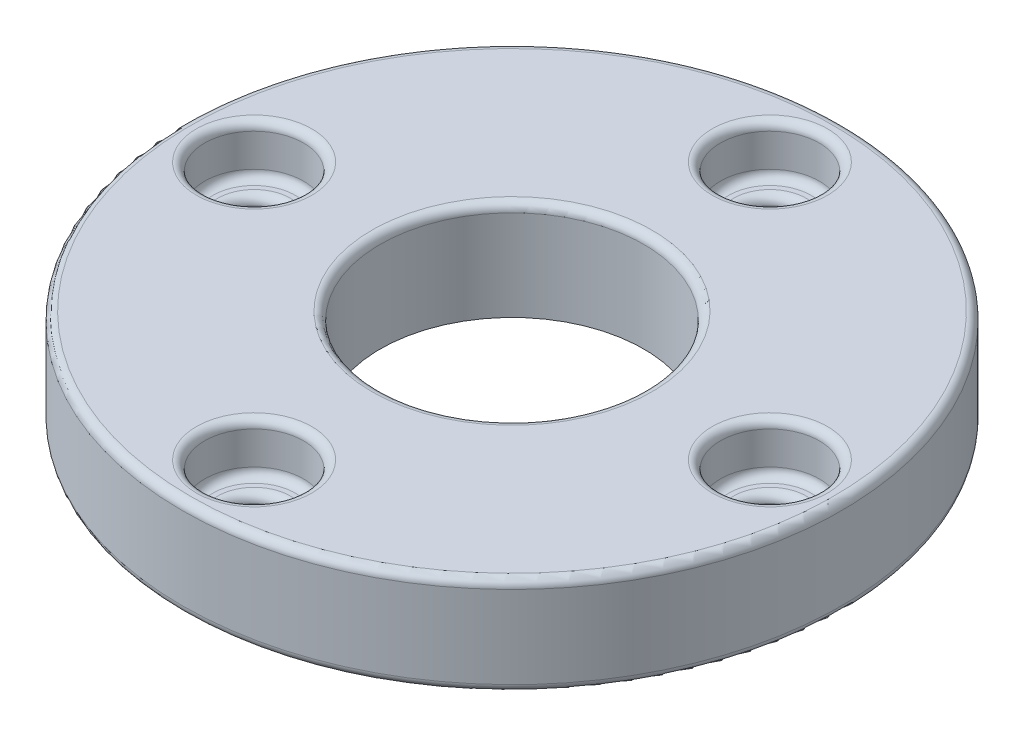
ISO-10303-21;
HEADER;
FILE_DESCRIPTION(('STEP AP214'),'2;1');
FILE_NAME('part.step','',(''),(''),'','','');
FILE_SCHEMA(('AUTOMOTIVE_DESIGN { 1 0 10303 214 1 1 1 1 }'));
ENDSEC;
DATA;
#1=APPLICATION_CONTEXT('core data for automotive mechanical design processes');
#2=APPLICATION_PROTOCOL_DEFINITION('international standard','automotive_design',2000,#1);
#3=PRODUCT_CONTEXT('',#1,'mechanical');
#4=PRODUCT('Part','Part','',(#3));
#5=PRODUCT_RELATED_PRODUCT_CATEGORY('part','',(#4));
#6=PRODUCT_DEFINITION_FORMATION('','',#4);
#7=PRODUCT_DEFINITION_CONTEXT('part definition',#1,'design');
#8=PRODUCT_DEFINITION('design','',#6,#7);
#9=PRODUCT_DEFINITION_SHAPE('','',#8);
#10=(LENGTH_UNIT() NAMED_UNIT(*) SI_UNIT(.MILLI.,.METRE.));
#11=(NAMED_UNIT(*) PLANE_ANGLE_UNIT() SI_UNIT($,.RADIAN.));
#12=(NAMED_UNIT(*) SI_UNIT($,.STERADIAN.) SOLID_ANGLE_UNIT());
#13=UNCERTAINTY_MEASURE_WITH_UNIT(LENGTH_MEASURE(1.E-05),#10,'distance_accuracy_value','');
#14=(GEOMETRIC_REPRESENTATION_CONTEXT(3) GLOBAL_UNCERTAINTY_ASSIGNED_CONTEXT((#13)) GLOBAL_UNIT_ASSIGNED_CONTEXT((#10,
#11,#12)) REPRESENTATION_CONTEXT('',''));
#15=CARTESIAN_POINT('',(0.,0.,0.));
#16=DIRECTION('',(0.,0.,1.));
#17=DIRECTION('',(1.,0.,0.));
#18=AXIS2_PLACEMENT_3D('',#15,#16,#17);
#19=CARTESIAN_POINT('',(15.65,0.,0.));
#20=DIRECTION('',(0.,1.,0.));
#21=DIRECTION('',(0.,0.,1.));
#22=AXIS2_PLACEMENT_3D('',#19,#20,#21);
#23=CYLINDRICAL_SURFACE('',#22,1.7);
#24=CARTESIAN_POINT('',(15.65,2.5,0.));
#25=DIRECTION('',(0.,1.,0.));
#26=DIRECTION('',(0.,0.,1.));
#27=AXIS2_PLACEMENT_3D('',#24,#25,#26);
#28=CIRCLE('',#27,1.7);
#29=CARTESIAN_POINT('',(15.65,2.5,1.7));
#30=VERTEX_POINT('',#29);
#31=EDGE_CURVE('E78',#30,#30,#28,.T.);
#32=ORIENTED_EDGE('',*,*,#31,.T.);
#33=EDGE_LOOP('',(#32));
#34=FACE_BOUND('',#33,.T.);
#35=CARTESIAN_POINT('',(15.65,0.,0.));
#36=DIRECTION('',(0.,1.,0.));
#37=DIRECTION('',(0.,0.,1.));
#38=AXIS2_PLACEMENT_3D('',#35,#36,#37);
#39=CIRCLE('',#38,1.7);
#40=CARTESIAN_POINT('',(15.65,0.,1.7));
#41=VERTEX_POINT('',#40);
#42=EDGE_CURVE('E139',#41,#41,#39,.T.);
#43=ORIENTED_EDGE('',*,*,#42,.F.);
#44=EDGE_LOOP('',(#43));
#45=FACE_BOUND('',#44,.T.);
#46=ADVANCED_FACE('F37',(#34,#45),#23,.F.);
#47=CARTESIAN_POINT('',(0.,0.,15.65));
#48=DIRECTION('',(0.,1.,0.));
#49=DIRECTION('',(0.,0.,1.));
#50=AXIS2_PLACEMENT_3D('',#47,#48,#49);
#51=CYLINDRICAL_SURFACE('',#50,1.7);
#52=CARTESIAN_POINT('',(0.,2.5,15.65));
#53=DIRECTION('',(0.,1.,0.));
#54=DIRECTION('',(0.,0.,1.));
#55=AXIS2_PLACEMENT_3D('',#52,#53,#54);
#56=CIRCLE('',#55,1.7);
#57=CARTESIAN_POINT('',(0.,2.5,17.35));
#58=VERTEX_POINT('',#57);
#59=EDGE_CURVE('E90',#58,#58,#56,.T.);
#60=ORIENTED_EDGE('',*,*,#59,.T.);
#61=EDGE_LOOP('',(#60));
#62=FACE_BOUND('',#61,.T.);
#63=CARTESIAN_POINT('',(0.,0.,15.65));
#64=DIRECTION('',(0.,1.,0.));
#65=DIRECTION('',(0.,0.,1.));
#66=AXIS2_PLACEMENT_3D('',#63,#64,#65);
#67=CIRCLE('',#66,1.7);
#68=CARTESIAN_POINT('',(0.,0.,17.35));
#69=VERTEX_POINT('',#68);
#70=EDGE_CURVE('E142',#69,#69,#67,.T.);
#71=ORIENTED_EDGE('',*,*,#70,.F.);
#72=EDGE_LOOP('',(#71));
#73=FACE_BOUND('',#72,.T.);
#74=ADVANCED_FACE('F167',(#62,#73),#51,.F.);
#75=CARTESIAN_POINT('',(-15.65,0.,0.));
#76=DIRECTION('',(0.,1.,0.));
#77=DIRECTION('',(0.,0.,1.));
#78=AXIS2_PLACEMENT_3D('',#75,#76,#77);
#79=CYLINDRICAL_SURFACE('',#78,1.7);
#80=CARTESIAN_POINT('',(-15.65,2.5,0.));
#81=DIRECTION('',(0.,1.,0.));
#82=DIRECTION('',(0.,0.,1.));
#83=AXIS2_PLACEMENT_3D('',#80,#81,#82);
#84=CIRCLE('',#83,1.7);
#85=CARTESIAN_POINT('',(-15.65,2.5,1.7));
#86=VERTEX_POINT('',#85);
#87=EDGE_CURVE('E66',#86,#86,#84,.T.);
#88=ORIENTED_EDGE('',*,*,#87,.T.);
#89=EDGE_LOOP('',(#88));
#90=FACE_BOUND('',#89,.T.);
#91=CARTESIAN_POINT('',(-15.65,0.,0.));
#92=DIRECTION('',(0.,1.,0.));
#93=DIRECTION('',(0.,0.,1.));
#94=AXIS2_PLACEMENT_3D('',#91,#92,#93);
#95=CIRCLE('',#94,1.7);
#96=CARTESIAN_POINT('',(-15.65,0.,1.7));
#97=VERTEX_POINT('',#96);
#98=EDGE_CURVE('E145',#97,#97,#95,.T.);
#99=ORIENTED_EDGE('',*,*,#98,.F.);
#100=EDGE_LOOP('',(#99));
#101=FACE_BOUND('',#100,.T.);
#102=ADVANCED_FACE('F157',(#90,#101),#79,.F.);
#103=CARTESIAN_POINT('',(0.,0.,-15.65));
#104=DIRECTION('',(0.,1.,0.));
#105=DIRECTION('',(0.,0.,1.));
#106=AXIS2_PLACEMENT_3D('',#103,#104,#105);
#107=CYLINDRICAL_SURFACE('',#106,1.7);
#108=CARTESIAN_POINT('',(0.,2.5,-15.65));
#109=DIRECTION('',(0.,1.,0.));
#110=DIRECTION('',(0.,0.,1.));
#111=AXIS2_PLACEMENT_3D('',#108,#109,#110);
#112=CIRCLE('',#111,1.7);
#113=CARTESIAN_POINT('',(0.,2.5,-13.95));
#114=VERTEX_POINT('',#113);
#115=EDGE_CURVE('E52',#114,#114,#112,.T.);
#116=ORIENTED_EDGE('',*,*,#115,.T.);
#117=EDGE_LOOP('',(#116));
#118=FACE_BOUND('',#117,.T.);
#119=CARTESIAN_POINT('',(0.,0.,-15.65));
#120=DIRECTION('',(0.,1.,0.));
#121=DIRECTION('',(0.,0.,1.));
#122=AXIS2_PLACEMENT_3D('',#119,#120,#121);
#123=CIRCLE('',#122,1.7);
#124=CARTESIAN_POINT('',(0.,0.,-13.95));
#125=VERTEX_POINT('',#124);
#126=EDGE_CURVE('E138',#125,#125,#123,.T.);
#127=ORIENTED_EDGE('',*,*,#126,.F.);
#128=EDGE_LOOP('',(#127));
#129=FACE_BOUND('',#128,.T.);
#130=ADVANCED_FACE('F154',(#118,#129),#107,.F.);
#131=CARTESIAN_POINT('',(0.,6.,0.));
#132=DIRECTION('',(0.,-1.,0.));
#133=DIRECTION('',(0.,0.,-1.));
#134=AXIS2_PLACEMENT_3D('',#131,#132,#133);
#135=CYLINDRICAL_SURFACE('',#134,20.);
#136=CARTESIAN_POINT('',(0.,0.5,0.));
#137=DIRECTION('',(0.,1.,0.));
#138=DIRECTION('',(0.,0.,1.));
#139=AXIS2_PLACEMENT_3D('',#136,#137,#138);
#140=CIRCLE('',#139,20.);
#141=CARTESIAN_POINT('',(0.,0.5,20.));
#142=VERTEX_POINT('',#141);
#143=EDGE_CURVE('E44',#142,#142,#140,.T.);
#144=ORIENTED_EDGE('',*,*,#143,.T.);
#145=EDGE_LOOP('',(#144));
#146=FACE_BOUND('',#145,.T.);
#147=CARTESIAN_POINT('',(0.,5.5,0.));
#148=DIRECTION('',(0.,1.,0.));
#149=DIRECTION('',(0.,0.,1.));
#150=AXIS2_PLACEMENT_3D('',#147,#148,#149);
#151=CIRCLE('',#150,20.);
#152=CARTESIAN_POINT('',(0.,5.5,20.));
#153=VERTEX_POINT('',#152);
#154=EDGE_CURVE('E114',#153,#153,#151,.F.);
#155=ORIENTED_EDGE('',*,*,#154,.T.);
#156=EDGE_LOOP('',(#155));
#157=FACE_BOUND('',#156,.T.);
#158=ADVANCED_FACE('F156',(#146,#157),#135,.T.);
#159=CARTESIAN_POINT('',(0.,6.,0.));
#160=DIRECTION('',(0.,1.,0.));
#161=DIRECTION('',(0.,0.,1.));
#162=AXIS2_PLACEMENT_3D('',#159,#160,#161);
#163=PLANE('',#162);
#164=CARTESIAN_POINT('',(0.,6.,0.));
#165=DIRECTION('',(0.,1.,0.));
#166=DIRECTION('',(0.,0.,1.));
#167=AXIS2_PLACEMENT_3D('',#164,#165,#166);
#168=CIRCLE('',#167,19.5);
#169=CARTESIAN_POINT('',(0.,6.,19.5));
#170=VERTEX_POINT('',#169);
#171=EDGE_CURVE('E117',#170,#170,#168,.T.);
#172=ORIENTED_EDGE('',*,*,#171,.T.);
#173=EDGE_LOOP('',(#172));
#174=FACE_BOUND('',#173,.T.);
#175=CARTESIAN_POINT('',(0.,6.,0.));
#176=DIRECTION('',(0.,1.,0.));
#177=DIRECTION('',(0.,0.,1.));
#178=AXIS2_PLACEMENT_3D('',#175,#176,#177);
#179=CIRCLE('',#178,8.5);
#180=CARTESIAN_POINT('',(0.,6.,8.5));
#181=VERTEX_POINT('',#180);
#182=EDGE_CURVE('E120',#181,#181,#179,.F.);
#183=ORIENTED_EDGE('',*,*,#182,.T.);
#184=EDGE_LOOP('',(#183));
#185=FACE_BOUND('',#184,.T.);
#186=CARTESIAN_POINT('',(15.65,6.,0.));
#187=DIRECTION('',(0.,1.,0.));
#188=DIRECTION('',(0.,0.,1.));
#189=AXIS2_PLACEMENT_3D('',#186,#187,#188);
#190=CIRCLE('',#189,3.5);
#191=CARTESIAN_POINT('',(15.65,6.,3.5));
#192=VERTEX_POINT('',#191);
#193=EDGE_CURVE('E123',#192,#192,#190,.F.);
#194=ORIENTED_EDGE('',*,*,#193,.T.);
#195=EDGE_LOOP('',(#194));
#196=FACE_BOUND('',#195,.T.);
#197=CARTESIAN_POINT('',(0.,6.,15.65));
#198=DIRECTION('',(0.,1.,0.));
#199=DIRECTION('',(0.,0.,1.));
#200=AXIS2_PLACEMENT_3D('',#197,#198,#199);
#201=CIRCLE('',#200,3.5);
#202=CARTESIAN_POINT('',(0.,6.,19.15));
#203=VERTEX_POINT('',#202);
#204=EDGE_CURVE('E126',#203,#203,#201,.F.);
#205=ORIENTED_EDGE('',*,*,#204,.T.);
#206=EDGE_LOOP('',(#205));
#207=FACE_BOUND('',#206,.T.);
#208=CARTESIAN_POINT('',(-15.65,6.,0.));
#209=DIRECTION('',(0.,1.,0.));
#210=DIRECTION('',(0.,0.,1.));
#211=AXIS2_PLACEMENT_3D('',#208,#209,#210);
#212=CIRCLE('',#211,3.5);
#213=CARTESIAN_POINT('',(-15.65,6.,3.5));
#214=VERTEX_POINT('',#213);
#215=EDGE_CURVE('E129',#214,#214,#212,.F.);
#216=ORIENTED_EDGE('',*,*,#215,.T.);
#217=EDGE_LOOP('',(#216));
#218=FACE_BOUND('',#217,.T.);
#219=CARTESIAN_POINT('',(0.,6.,-15.65));
#220=DIRECTION('',(0.,1.,0.));
#221=DIRECTION('',(0.,0.,1.));
#222=AXIS2_PLACEMENT_3D('',#219,#220,#221);
#223=CIRCLE('',#222,3.5);
#224=CARTESIAN_POINT('',(0.,6.,-12.15));
#225=VERTEX_POINT('',#224);
#226=EDGE_CURVE('E132',#225,#225,#223,.F.);
#227=ORIENTED_EDGE('',*,*,#226,.T.);
#228=EDGE_LOOP('',(#227));
#229=FACE_BOUND('',#228,.T.);
#230=ADVANCED_FACE('F165',(#174,#185,#196,#207,#218,#229),#163,.T.);
#231=CARTESIAN_POINT('',(0.,0.,0.));
#232=DIRECTION('',(0.,1.,0.));
#233=DIRECTION('',(0.,0.,1.));
#234=AXIS2_PLACEMENT_3D('',#231,#232,#233);
#235=PLANE('',#234);
#236=CARTESIAN_POINT('',(0.,0.,0.));
#237=DIRECTION('',(0.,1.,0.));
#238=DIRECTION('',(0.,0.,1.));
#239=AXIS2_PLACEMENT_3D('',#236,#237,#238);
#240=CIRCLE('',#239,19.5);
#241=CARTESIAN_POINT('',(0.,0.,19.5));
#242=VERTEX_POINT('',#241);
#243=EDGE_CURVE('E10',#242,#242,#240,.F.);
#244=ORIENTED_EDGE('',*,*,#243,.T.);
#245=EDGE_LOOP('',(#244));
#246=FACE_BOUND('',#245,.T.);
#247=ORIENTED_EDGE('',*,*,#126,.T.);
#248=EDGE_LOOP('',(#247));
#249=FACE_BOUND('',#248,.T.);
#250=ORIENTED_EDGE('',*,*,#98,.T.);
#251=EDGE_LOOP('',(#250));
#252=FACE_BOUND('',#251,.T.);
#253=ORIENTED_EDGE('',*,*,#70,.T.);
#254=EDGE_LOOP('',(#253));
#255=FACE_BOUND('',#254,.T.);
#256=ORIENTED_EDGE('',*,*,#42,.T.);
#257=EDGE_LOOP('',(#256));
#258=FACE_BOUND('',#257,.T.);
#259=CARTESIAN_POINT('',(0.,0.,0.));
#260=DIRECTION('',(0.,1.,0.));
#261=DIRECTION('',(0.,0.,1.));
#262=AXIS2_PLACEMENT_3D('',#259,#260,#261);
#263=CIRCLE('',#262,8.);
#264=CARTESIAN_POINT('',(0.,0.,8.));
#265=VERTEX_POINT('',#264);
#266=EDGE_CURVE('E135',#265,#265,#263,.T.);
#267=ORIENTED_EDGE('',*,*,#266,.T.);
#268=EDGE_LOOP('',(#267));
#269=FACE_BOUND('',#268,.T.);
#270=ADVANCED_FACE('F151',(#246,#249,#252,#255,#258,#269),#235,.F.);
#271=CARTESIAN_POINT('',(0.,0.,0.));
#272=DIRECTION('',(0.,1.,0.));
#273=DIRECTION('',(0.,0.,1.));
#274=AXIS2_PLACEMENT_3D('',#271,#272,#273);
#275=CYLINDRICAL_SURFACE('',#274,8.);
#276=CARTESIAN_POINT('',(0.,5.5,0.));
#277=DIRECTION('',(0.,1.,0.));
#278=DIRECTION('',(0.,0.,1.));
#279=AXIS2_PLACEMENT_3D('',#276,#277,#278);
#280=CIRCLE('',#279,8.);
#281=CARTESIAN_POINT('',(0.,5.5,8.));
#282=VERTEX_POINT('',#281);
#283=EDGE_CURVE('E111',#282,#282,#280,.T.);
#284=ORIENTED_EDGE('',*,*,#283,.T.);
#285=EDGE_LOOP('',(#284));
#286=FACE_BOUND('',#285,.T.);
#287=ORIENTED_EDGE('',*,*,#266,.F.);
#288=EDGE_LOOP('',(#287));
#289=FACE_BOUND('',#288,.T.);
#290=ADVANCED_FACE('F182',(#286,#289),#275,.F.);
#291=CARTESIAN_POINT('',(0.,3.,-15.65));
#292=DIRECTION('',(0.,1.,0.));
#293=DIRECTION('',(0.,0.,1.));
#294=AXIS2_PLACEMENT_3D('',#291,#292,#293);
#295=PLANE('',#294);
#296=CARTESIAN_POINT('',(0.,3.,-15.65));
#297=DIRECTION('',(0.,1.,0.));
#298=DIRECTION('',(0.,0.,1.));
#299=AXIS2_PLACEMENT_3D('',#296,#297,#298);
#300=CIRCLE('',#299,2.2);
#301=CARTESIAN_POINT('',(0.,3.,-13.45));
#302=VERTEX_POINT('',#301);
#303=EDGE_CURVE('E57',#302,#302,#300,.F.);
#304=ORIENTED_EDGE('',*,*,#303,.T.);
#305=EDGE_LOOP('',(#304));
#306=FACE_BOUND('',#305,.T.);
#307=CARTESIAN_POINT('',(0.,3.,-15.65));
#308=DIRECTION('',(0.,1.,0.));
#309=DIRECTION('',(0.,0.,1.));
#310=AXIS2_PLACEMENT_3D('',#307,#308,#309);
#311=CIRCLE('',#310,2.5);
#312=CARTESIAN_POINT('',(0.,3.,-13.15));
#313=VERTEX_POINT('',#312);
#314=EDGE_CURVE('E60',#313,#313,#311,.T.);
#315=ORIENTED_EDGE('',*,*,#314,.T.);
#316=EDGE_LOOP('',(#315));
#317=FACE_BOUND('',#316,.T.);
#318=ADVANCED_FACE('F185',(#306,#317),#295,.T.);
#319=CARTESIAN_POINT('',(0.,3.,-15.65));
#320=DIRECTION('',(0.,1.,0.));
#321=DIRECTION('',(0.,0.,1.));
#322=AXIS2_PLACEMENT_3D('',#319,#320,#321);
#323=CYLINDRICAL_SURFACE('',#322,3.);
#324=CARTESIAN_POINT('',(0.,3.5,-15.65));
#325=DIRECTION('',(0.,1.,0.));
#326=DIRECTION('',(0.,0.,1.));
#327=AXIS2_PLACEMENT_3D('',#324,#325,#326);
#328=CIRCLE('',#327,3.);
#329=CARTESIAN_POINT('',(0.,3.5,-12.65));
#330=VERTEX_POINT('',#329);
#331=EDGE_CURVE('E48',#330,#330,#328,.F.);
#332=ORIENTED_EDGE('',*,*,#331,.T.);
#333=EDGE_LOOP('',(#332));
#334=FACE_BOUND('',#333,.T.);
#335=CARTESIAN_POINT('',(0.,5.5,-15.65));
#336=DIRECTION('',(0.,1.,0.));
#337=DIRECTION('',(0.,0.,1.));
#338=AXIS2_PLACEMENT_3D('',#335,#336,#337);
#339=CIRCLE('',#338,3.);
#340=CARTESIAN_POINT('',(0.,5.5,-12.65));
#341=VERTEX_POINT('',#340);
#342=EDGE_CURVE('E99',#341,#341,#339,.T.);
#343=ORIENTED_EDGE('',*,*,#342,.T.);
#344=EDGE_LOOP('',(#343));
#345=FACE_BOUND('',#344,.T.);
#346=ADVANCED_FACE('F254',(#334,#345),#323,.F.);
#347=CARTESIAN_POINT('',(-15.65,3.,0.));
#348=DIRECTION('',(0.,1.,0.));
#349=DIRECTION('',(0.,0.,1.));
#350=AXIS2_PLACEMENT_3D('',#347,#348,#349);
#351=PLANE('',#350);
#352=CARTESIAN_POINT('',(-15.65,3.,0.));
#353=DIRECTION('',(0.,1.,0.));
#354=DIRECTION('',(0.,0.,1.));
#355=AXIS2_PLACEMENT_3D('',#352,#353,#354);
#356=CIRCLE('',#355,2.2);
#357=CARTESIAN_POINT('',(-15.65,3.,2.2));
#358=VERTEX_POINT('',#357);
#359=EDGE_CURVE('E69',#358,#358,#356,.F.);
#360=ORIENTED_EDGE('',*,*,#359,.T.);
#361=EDGE_LOOP('',(#360));
#362=FACE_BOUND('',#361,.T.);
#363=CARTESIAN_POINT('',(-15.65,3.,0.));
#364=DIRECTION('',(0.,1.,0.));
#365=DIRECTION('',(0.,0.,1.));
#366=AXIS2_PLACEMENT_3D('',#363,#364,#365);
#367=CIRCLE('',#366,2.5);
#368=CARTESIAN_POINT('',(-15.65,3.,2.5));
#369=VERTEX_POINT('',#368);
#370=EDGE_CURVE('E72',#369,#369,#367,.T.);
#371=ORIENTED_EDGE('',*,*,#370,.T.);
#372=EDGE_LOOP('',(#371));
#373=FACE_BOUND('',#372,.T.);
#374=ADVANCED_FACE('F260',(#362,#373),#351,.T.);
#375=CARTESIAN_POINT('',(-15.65,3.,0.));
#376=DIRECTION('',(0.,1.,0.));
#377=DIRECTION('',(0.,0.,1.));
#378=AXIS2_PLACEMENT_3D('',#375,#376,#377);
#379=CYLINDRICAL_SURFACE('',#378,3.);
#380=CARTESIAN_POINT('',(-15.65,3.5,0.));
#381=DIRECTION('',(0.,1.,0.));
#382=DIRECTION('',(0.,0.,1.));
#383=AXIS2_PLACEMENT_3D('',#380,#381,#382);
#384=CIRCLE('',#383,3.);
#385=CARTESIAN_POINT('',(-15.65,3.5,3.));
#386=VERTEX_POINT('',#385);
#387=EDGE_CURVE('E63',#386,#386,#384,.F.);
#388=ORIENTED_EDGE('',*,*,#387,.T.);
#389=EDGE_LOOP('',(#388));
#390=FACE_BOUND('',#389,.T.);
#391=CARTESIAN_POINT('',(-15.65,5.5,0.));
#392=DIRECTION('',(0.,1.,0.));
#393=DIRECTION('',(0.,0.,1.));
#394=AXIS2_PLACEMENT_3D('',#391,#392,#393);
#395=CIRCLE('',#394,3.);
#396=CARTESIAN_POINT('',(-15.65,5.5,3.));
#397=VERTEX_POINT('',#396);
#398=EDGE_CURVE('E102',#397,#397,#395,.T.);
#399=ORIENTED_EDGE('',*,*,#398,.T.);
#400=EDGE_LOOP('',(#399));
#401=FACE_BOUND('',#400,.T.);
#402=ADVANCED_FACE('F264',(#390,#401),#379,.F.);
#403=CARTESIAN_POINT('',(0.,3.,15.65));
#404=DIRECTION('',(0.,1.,0.));
#405=DIRECTION('',(0.,0.,1.));
#406=AXIS2_PLACEMENT_3D('',#403,#404,#405);
#407=PLANE('',#406);
#408=CARTESIAN_POINT('',(0.,3.,15.65));
#409=DIRECTION('',(0.,1.,0.));
#410=DIRECTION('',(0.,0.,1.));
#411=AXIS2_PLACEMENT_3D('',#408,#409,#410);
#412=CIRCLE('',#411,2.2);
#413=CARTESIAN_POINT('',(0.,3.,17.85));
#414=VERTEX_POINT('',#413);
#415=EDGE_CURVE('E93',#414,#414,#412,.F.);
#416=ORIENTED_EDGE('',*,*,#415,.T.);
#417=EDGE_LOOP('',(#416));
#418=FACE_BOUND('',#417,.T.);
#419=CARTESIAN_POINT('',(0.,3.,15.65));
#420=DIRECTION('',(0.,1.,0.));
#421=DIRECTION('',(0.,0.,1.));
#422=AXIS2_PLACEMENT_3D('',#419,#420,#421);
#423=CIRCLE('',#422,2.5);
#424=CARTESIAN_POINT('',(0.,3.,18.15));
#425=VERTEX_POINT('',#424);
#426=EDGE_CURVE('E96',#425,#425,#423,.T.);
#427=ORIENTED_EDGE('',*,*,#426,.T.);
#428=EDGE_LOOP('',(#427));
#429=FACE_BOUND('',#428,.T.);
#430=ADVANCED_FACE('F267',(#418,#429),#407,.T.);
#431=CARTESIAN_POINT('',(0.,3.,15.65));
#432=DIRECTION('',(0.,1.,0.));
#433=DIRECTION('',(0.,0.,1.));
#434=AXIS2_PLACEMENT_3D('',#431,#432,#433);
#435=CYLINDRICAL_SURFACE('',#434,3.);
#436=CARTESIAN_POINT('',(0.,3.5,15.65));
#437=DIRECTION('',(0.,1.,0.));
#438=DIRECTION('',(0.,0.,1.));
#439=AXIS2_PLACEMENT_3D('',#436,#437,#438);
#440=CIRCLE('',#439,3.);
#441=CARTESIAN_POINT('',(0.,3.5,18.65));
#442=VERTEX_POINT('',#441);
#443=EDGE_CURVE('E87',#442,#442,#440,.F.);
#444=ORIENTED_EDGE('',*,*,#443,.T.);
#445=EDGE_LOOP('',(#444));
#446=FACE_BOUND('',#445,.T.);
#447=CARTESIAN_POINT('',(0.,5.5,15.65));
#448=DIRECTION('',(0.,1.,0.));
#449=DIRECTION('',(0.,0.,1.));
#450=AXIS2_PLACEMENT_3D('',#447,#448,#449);
#451=CIRCLE('',#450,3.);
#452=CARTESIAN_POINT('',(0.,5.5,18.65));
#453=VERTEX_POINT('',#452);
#454=EDGE_CURVE('E105',#453,#453,#451,.T.);
#455=ORIENTED_EDGE('',*,*,#454,.T.);
#456=EDGE_LOOP('',(#455));
#457=FACE_BOUND('',#456,.T.);
#458=ADVANCED_FACE('F272',(#446,#457),#435,.F.);
#459=CARTESIAN_POINT('',(15.65,3.,0.));
#460=DIRECTION('',(0.,1.,0.));
#461=DIRECTION('',(0.,0.,1.));
#462=AXIS2_PLACEMENT_3D('',#459,#460,#461);
#463=PLANE('',#462);
#464=CARTESIAN_POINT('',(15.65,3.,0.));
#465=DIRECTION('',(0.,1.,0.));
#466=DIRECTION('',(0.,0.,1.));
#467=AXIS2_PLACEMENT_3D('',#464,#465,#466);
#468=CIRCLE('',#467,2.2);
#469=CARTESIAN_POINT('',(15.65,3.,2.2));
#470=VERTEX_POINT('',#469);
#471=EDGE_CURVE('E81',#470,#470,#468,.F.);
#472=ORIENTED_EDGE('',*,*,#471,.T.);
#473=EDGE_LOOP('',(#472));
#474=FACE_BOUND('',#473,.T.);
#475=CARTESIAN_POINT('',(15.65,3.,0.));
#476=DIRECTION('',(0.,1.,0.));
#477=DIRECTION('',(0.,0.,1.));
#478=AXIS2_PLACEMENT_3D('',#475,#476,#477);
#479=CIRCLE('',#478,2.5);
#480=CARTESIAN_POINT('',(15.65,3.,2.5));
#481=VERTEX_POINT('',#480);
#482=EDGE_CURVE('E84',#481,#481,#479,.T.);
#483=ORIENTED_EDGE('',*,*,#482,.T.);
#484=EDGE_LOOP('',(#483));
#485=FACE_BOUND('',#484,.T.);
#486=ADVANCED_FACE('F275',(#474,#485),#463,.T.);
#487=CARTESIAN_POINT('',(15.65,3.,0.));
#488=DIRECTION('',(0.,1.,0.));
#489=DIRECTION('',(0.,0.,1.));
#490=AXIS2_PLACEMENT_3D('',#487,#488,#489);
#491=CYLINDRICAL_SURFACE('',#490,3.);
#492=CARTESIAN_POINT('',(15.65,3.5,0.));
#493=DIRECTION('',(0.,1.,0.));
#494=DIRECTION('',(0.,0.,1.));
#495=AXIS2_PLACEMENT_3D('',#492,#493,#494);
#496=CIRCLE('',#495,3.);
#497=CARTESIAN_POINT('',(15.65,3.5,3.));
#498=VERTEX_POINT('',#497);
#499=EDGE_CURVE('E75',#498,#498,#496,.F.);
#500=ORIENTED_EDGE('',*,*,#499,.T.);
#501=EDGE_LOOP('',(#500));
#502=FACE_BOUND('',#501,.T.);
#503=CARTESIAN_POINT('',(15.65,5.5,0.));
#504=DIRECTION('',(0.,1.,0.));
#505=DIRECTION('',(0.,0.,1.));
#506=AXIS2_PLACEMENT_3D('',#503,#504,#505);
#507=CIRCLE('',#506,3.);
#508=CARTESIAN_POINT('',(15.65,5.5,3.));
#509=VERTEX_POINT('',#508);
#510=EDGE_CURVE('E108',#509,#509,#507,.T.);
#511=ORIENTED_EDGE('',*,*,#510,.T.);
#512=EDGE_LOOP('',(#511));
#513=FACE_BOUND('',#512,.T.);
#514=ADVANCED_FACE('F196',(#502,#513),#491,.F.);
#515=CARTESIAN_POINT('',(0.,5.5,0.));
#516=DIRECTION('',(0.,1.,0.));
#517=DIRECTION('',(0.,0.,1.));
#518=AXIS2_PLACEMENT_3D('',#515,#516,#517);
#519=TOROIDAL_SURFACE('',#518,19.5,0.5);
#520=ORIENTED_EDGE('',*,*,#154,.F.);
#521=EDGE_LOOP('',(#520));
#522=FACE_BOUND('',#521,.T.);
#523=ORIENTED_EDGE('',*,*,#171,.F.);
#524=EDGE_LOOP('',(#523));
#525=FACE_BOUND('',#524,.T.);
#526=ADVANCED_FACE('F192',(#522,#525),#519,.T.);
#527=CARTESIAN_POINT('',(0.,5.5,0.));
#528=DIRECTION('',(0.,1.,0.));
#529=DIRECTION('',(0.,0.,1.));
#530=AXIS2_PLACEMENT_3D('',#527,#528,#529);
#531=TOROIDAL_SURFACE('',#530,8.5,0.5);
#532=ORIENTED_EDGE('',*,*,#182,.F.);
#533=EDGE_LOOP('',(#532));
#534=FACE_BOUND('',#533,.T.);
#535=ORIENTED_EDGE('',*,*,#283,.F.);
#536=EDGE_LOOP('',(#535));
#537=FACE_BOUND('',#536,.T.);
#538=ADVANCED_FACE('F195',(#534,#537),#531,.T.);
#539=CARTESIAN_POINT('',(15.65,5.5,0.));
#540=DIRECTION('',(0.,1.,0.));
#541=DIRECTION('',(0.,0.,1.));
#542=AXIS2_PLACEMENT_3D('',#539,#540,#541);
#543=TOROIDAL_SURFACE('',#542,3.5,0.5);
#544=ORIENTED_EDGE('',*,*,#193,.F.);
#545=EDGE_LOOP('',(#544));
#546=FACE_BOUND('',#545,.T.);
#547=ORIENTED_EDGE('',*,*,#510,.F.);
#548=EDGE_LOOP('',(#547));
#549=FACE_BOUND('',#548,.T.);
#550=ADVANCED_FACE('F200',(#546,#549),#543,.T.);
#551=CARTESIAN_POINT('',(0.,5.5,15.65));
#552=DIRECTION('',(0.,1.,0.));
#553=DIRECTION('',(0.,0.,1.));
#554=AXIS2_PLACEMENT_3D('',#551,#552,#553);
#555=TOROIDAL_SURFACE('',#554,3.5,0.5);
#556=ORIENTED_EDGE('',*,*,#204,.F.);
#557=EDGE_LOOP('',(#556));
#558=FACE_BOUND('',#557,.T.);
#559=ORIENTED_EDGE('',*,*,#454,.F.);
#560=EDGE_LOOP('',(#559));
#561=FACE_BOUND('',#560,.T.);
#562=ADVANCED_FACE('F204',(#558,#561),#555,.T.);
#563=CARTESIAN_POINT('',(-15.65,5.5,0.));
#564=DIRECTION('',(0.,1.,0.));
#565=DIRECTION('',(0.,0.,1.));
#566=AXIS2_PLACEMENT_3D('',#563,#564,#565);
#567=TOROIDAL_SURFACE('',#566,3.5,0.5);
#568=ORIENTED_EDGE('',*,*,#215,.F.);
#569=EDGE_LOOP('',(#568));
#570=FACE_BOUND('',#569,.T.);
#571=ORIENTED_EDGE('',*,*,#398,.F.);
#572=EDGE_LOOP('',(#571));
#573=FACE_BOUND('',#572,.T.);
#574=ADVANCED_FACE('F208',(#570,#573),#567,.T.);
#575=CARTESIAN_POINT('',(0.,5.5,-15.65));
#576=DIRECTION('',(0.,1.,0.));
#577=DIRECTION('',(0.,0.,1.));
#578=AXIS2_PLACEMENT_3D('',#575,#576,#577);
#579=TOROIDAL_SURFACE('',#578,3.5,0.5);
#580=ORIENTED_EDGE('',*,*,#226,.F.);
#581=EDGE_LOOP('',(#580));
#582=FACE_BOUND('',#581,.T.);
#583=ORIENTED_EDGE('',*,*,#342,.F.);
#584=EDGE_LOOP('',(#583));
#585=FACE_BOUND('',#584,.T.);
#586=ADVANCED_FACE('F212',(#582,#585),#579,.T.);
#587=CARTESIAN_POINT('',(0.,2.5,15.65));
#588=DIRECTION('',(0.,1.,0.));
#589=DIRECTION('',(0.,0.,1.));
#590=AXIS2_PLACEMENT_3D('',#587,#588,#589);
#591=TOROIDAL_SURFACE('',#590,2.2,0.5);
#592=ORIENTED_EDGE('',*,*,#59,.F.);
#593=EDGE_LOOP('',(#592));
#594=FACE_BOUND('',#593,.T.);
#595=ORIENTED_EDGE('',*,*,#415,.F.);
#596=EDGE_LOOP('',(#595));
#597=FACE_BOUND('',#596,.T.);
#598=ADVANCED_FACE('F215',(#594,#597),#591,.T.);
#599=CARTESIAN_POINT('',(0.,3.5,15.65));
#600=DIRECTION('',(0.,1.,0.));
#601=DIRECTION('',(0.,0.,1.));
#602=AXIS2_PLACEMENT_3D('',#599,#600,#601);
#603=TOROIDAL_SURFACE('',#602,2.5,0.5);
#604=ORIENTED_EDGE('',*,*,#443,.F.);
#605=EDGE_LOOP('',(#604));
#606=FACE_BOUND('',#605,.T.);
#607=ORIENTED_EDGE('',*,*,#426,.F.);
#608=EDGE_LOOP('',(#607));
#609=FACE_BOUND('',#608,.T.);
#610=ADVANCED_FACE('F219',(#606,#609),#603,.F.);
#611=CARTESIAN_POINT('',(15.65,2.5,0.));
#612=DIRECTION('',(0.,1.,0.));
#613=DIRECTION('',(0.,0.,1.));
#614=AXIS2_PLACEMENT_3D('',#611,#612,#613);
#615=TOROIDAL_SURFACE('',#614,2.2,0.5);
#616=ORIENTED_EDGE('',*,*,#31,.F.);
#617=EDGE_LOOP('',(#616));
#618=FACE_BOUND('',#617,.T.);
#619=ORIENTED_EDGE('',*,*,#471,.F.);
#620=EDGE_LOOP('',(#619));
#621=FACE_BOUND('',#620,.T.);
#622=ADVANCED_FACE('F223',(#618,#621),#615,.T.);
#623=CARTESIAN_POINT('',(15.65,3.5,0.));
#624=DIRECTION('',(0.,1.,0.));
#625=DIRECTION('',(0.,0.,1.));
#626=AXIS2_PLACEMENT_3D('',#623,#624,#625);
#627=TOROIDAL_SURFACE('',#626,2.5,0.5);
#628=ORIENTED_EDGE('',*,*,#499,.F.);
#629=EDGE_LOOP('',(#628));
#630=FACE_BOUND('',#629,.T.);
#631=ORIENTED_EDGE('',*,*,#482,.F.);
#632=EDGE_LOOP('',(#631));
#633=FACE_BOUND('',#632,.T.);
#634=ADVANCED_FACE('F227',(#630,#633),#627,.F.);
#635=CARTESIAN_POINT('',(-15.65,2.5,0.));
#636=DIRECTION('',(0.,1.,0.));
#637=DIRECTION('',(0.,0.,1.));
#638=AXIS2_PLACEMENT_3D('',#635,#636,#637);
#639=TOROIDAL_SURFACE('',#638,2.2,0.5);
#640=ORIENTED_EDGE('',*,*,#87,.F.);
#641=EDGE_LOOP('',(#640));
#642=FACE_BOUND('',#641,.T.);
#643=ORIENTED_EDGE('',*,*,#359,.F.);
#644=EDGE_LOOP('',(#643));
#645=FACE_BOUND('',#644,.T.);
#646=ADVANCED_FACE('F231',(#642,#645),#639,.T.);
#647=CARTESIAN_POINT('',(-15.65,3.5,0.));
#648=DIRECTION('',(0.,1.,0.));
#649=DIRECTION('',(0.,0.,1.));
#650=AXIS2_PLACEMENT_3D('',#647,#648,#649);
#651=TOROIDAL_SURFACE('',#650,2.5,0.5);
#652=ORIENTED_EDGE('',*,*,#387,.F.);
#653=EDGE_LOOP('',(#652));
#654=FACE_BOUND('',#653,.T.);
#655=ORIENTED_EDGE('',*,*,#370,.F.);
#656=EDGE_LOOP('',(#655));
#657=FACE_BOUND('',#656,.T.);
#658=ADVANCED_FACE('F235',(#654,#657),#651,.F.);
#659=CARTESIAN_POINT('',(0.,2.5,-15.65));
#660=DIRECTION('',(0.,1.,0.));
#661=DIRECTION('',(0.,0.,1.));
#662=AXIS2_PLACEMENT_3D('',#659,#660,#661);
#663=TOROIDAL_SURFACE('',#662,2.2,0.5);
#664=ORIENTED_EDGE('',*,*,#115,.F.);
#665=EDGE_LOOP('',(#664));
#666=FACE_BOUND('',#665,.T.);
#667=ORIENTED_EDGE('',*,*,#303,.F.);
#668=EDGE_LOOP('',(#667));
#669=FACE_BOUND('',#668,.T.);
#670=ADVANCED_FACE('F239',(#666,#669),#663,.T.);
#671=CARTESIAN_POINT('',(0.,3.5,-15.65));
#672=DIRECTION('',(0.,1.,0.));
#673=DIRECTION('',(0.,0.,1.));
#674=AXIS2_PLACEMENT_3D('',#671,#672,#673);
#675=TOROIDAL_SURFACE('',#674,2.5,0.5);
#676=ORIENTED_EDGE('',*,*,#331,.F.);
#677=EDGE_LOOP('',(#676));
#678=FACE_BOUND('',#677,.T.);
#679=ORIENTED_EDGE('',*,*,#314,.F.);
#680=EDGE_LOOP('',(#679));
#681=FACE_BOUND('',#680,.T.);
#682=ADVANCED_FACE('F242',(#678,#681),#675,.F.);
#683=CARTESIAN_POINT('',(0.,0.5,0.));
#684=DIRECTION('',(0.,1.,0.));
#685=DIRECTION('',(0.,0.,1.));
#686=AXIS2_PLACEMENT_3D('',#683,#684,#685);
#687=TOROIDAL_SURFACE('',#686,19.5,0.5);
#688=ORIENTED_EDGE('',*,*,#243,.F.);
#689=EDGE_LOOP('',(#688));
#690=FACE_BOUND('',#689,.T.);
#691=ORIENTED_EDGE('',*,*,#143,.F.);
#692=EDGE_LOOP('',(#691));
#693=FACE_BOUND('',#692,.T.);
#694=ADVANCED_FACE('F39',(#690,#693),#687,.T.);
#695=CLOSED_SHELL('',(#46,#74,#102,#130,#158,#230,#270,#290,#318,#346,#374,#402,#430,#458,#486,
#514,#526,#538,#550,#562,#574,#586,#598,#610,#622,#634,#646,#658,#670,#682,#694));
#696=MANIFOLD_SOLID_BREP('B2',#695);
#697=ADVANCED_BREP_SHAPE_REPRESENTATION('',(#18,#696),#14);
#698=SHAPE_DEFINITION_REPRESENTATION(#9,#697);
ENDSEC;
END-ISO-10303-21;
